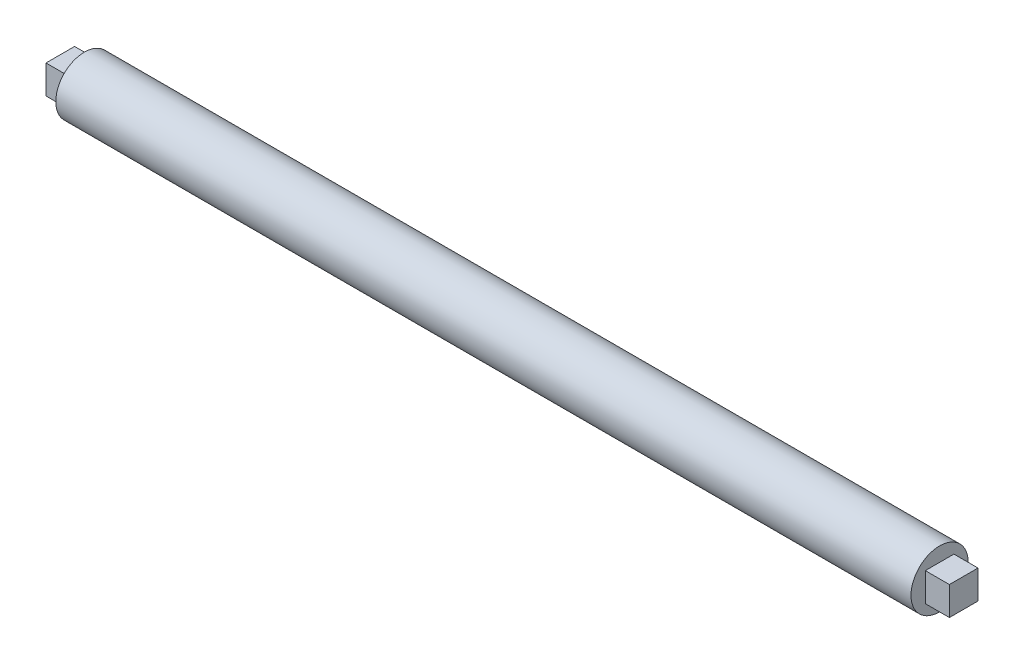
ISO-10303-21;
HEADER;
FILE_DESCRIPTION(('STEP AP214'),'2;1');
FILE_NAME('part.step','',(''),(''),'','','');
FILE_SCHEMA(('AUTOMOTIVE_DESIGN { 1 0 10303 214 1 1 1 1 }'));
ENDSEC;
DATA;
#1=APPLICATION_CONTEXT('core data for automotive mechanical design processes');
#2=APPLICATION_PROTOCOL_DEFINITION('international standard','automotive_design',2000,#1);
#3=PRODUCT_CONTEXT('',#1,'mechanical');
#4=PRODUCT('Part','Part','',(#3));
#5=PRODUCT_RELATED_PRODUCT_CATEGORY('part','',(#4));
#6=PRODUCT_DEFINITION_FORMATION('','',#4);
#7=PRODUCT_DEFINITION_CONTEXT('part definition',#1,'design');
#8=PRODUCT_DEFINITION('design','',#6,#7);
#9=PRODUCT_DEFINITION_SHAPE('','',#8);
#10=(LENGTH_UNIT() NAMED_UNIT(*) SI_UNIT(.MILLI.,.METRE.));
#11=(NAMED_UNIT(*) PLANE_ANGLE_UNIT() SI_UNIT($,.RADIAN.));
#12=(NAMED_UNIT(*) SI_UNIT($,.STERADIAN.) SOLID_ANGLE_UNIT());
#13=UNCERTAINTY_MEASURE_WITH_UNIT(LENGTH_MEASURE(1.E-05),#10,'distance_accuracy_value','');
#14=(GEOMETRIC_REPRESENTATION_CONTEXT(3) GLOBAL_UNCERTAINTY_ASSIGNED_CONTEXT((#13)) GLOBAL_UNIT_ASSIGNED_CONTEXT((#10,
#11,#12)) REPRESENTATION_CONTEXT('',''));
#15=CARTESIAN_POINT('',(0.,0.,0.));
#16=DIRECTION('',(0.,0.,1.));
#17=DIRECTION('',(1.,0.,0.));
#18=AXIS2_PLACEMENT_3D('',#15,#16,#17);
#19=CARTESIAN_POINT('',(0.,0.,0.));
#20=DIRECTION('',(-1.,0.,0.));
#21=DIRECTION('',(0.,0.,1.));
#22=AXIS2_PLACEMENT_3D('',#19,#20,#21);
#23=PLANE('',#22);
#24=DIRECTION('',(0.,0.,-1.));
#25=VECTOR('',#24,1.);
#26=CARTESIAN_POINT('',(0.,2.375,-4.75));
#27=LINE('',#26,#25);
#28=CARTESIAN_POINT('',(0.,2.375,-2.375));
#29=VERTEX_POINT('',#28);
#30=CARTESIAN_POINT('',(0.,2.375,-7.125));
#31=VERTEX_POINT('',#30);
#32=EDGE_CURVE('E56',#29,#31,#27,.T.);
#33=ORIENTED_EDGE('',*,*,#32,.F.);
#34=DIRECTION('',(0.,1.,0.));
#35=VECTOR('',#34,1.);
#36=CARTESIAN_POINT('',(0.,-2.375,-2.375));
#37=LINE('',#36,#35);
#38=CARTESIAN_POINT('',(0.,-2.375,-2.375));
#39=VERTEX_POINT('',#38);
#40=EDGE_CURVE('E60',#39,#29,#37,.T.);
#41=ORIENTED_EDGE('',*,*,#40,.F.);
#42=DIRECTION('',(0.,0.,1.));
#43=VECTOR('',#42,1.);
#44=CARTESIAN_POINT('',(0.,-2.375,-7.125));
#45=LINE('',#44,#43);
#46=CARTESIAN_POINT('',(0.,-2.375,-7.125));
#47=VERTEX_POINT('',#46);
#48=EDGE_CURVE('E142',#47,#39,#45,.T.);
#49=ORIENTED_EDGE('',*,*,#48,.F.);
#50=DIRECTION('',(0.,-1.,0.));
#51=VECTOR('',#50,1.);
#52=CARTESIAN_POINT('',(0.,2.375,-7.125));
#53=LINE('',#52,#51);
#54=EDGE_CURVE('E139',#31,#47,#53,.T.);
#55=ORIENTED_EDGE('',*,*,#54,.F.);
#56=EDGE_LOOP('',(#33,#41,#49,#55));
#57=FACE_BOUND('',#56,.T.);
#58=CARTESIAN_POINT('',(0.,0.,-4.75));
#59=DIRECTION('',(-1.,0.,0.));
#60=DIRECTION('',(0.,0.,1.));
#61=AXIS2_PLACEMENT_3D('',#58,#59,#60);
#62=CIRCLE('',#61,4.75);
#63=CARTESIAN_POINT('',(0.,0.,0.));
#64=VERTEX_POINT('',#63);
#65=EDGE_CURVE('E11',#64,#64,#62,.T.);
#66=ORIENTED_EDGE('',*,*,#65,.T.);
#67=EDGE_LOOP('',(#66));
#68=FACE_BOUND('',#67,.T.);
#69=ADVANCED_FACE('F41',(#57,#68),#23,.T.);
#70=CARTESIAN_POINT('',(142.,0.,-4.75));
#71=DIRECTION('',(1.,0.,0.));
#72=DIRECTION('',(0.,0.,-1.));
#73=AXIS2_PLACEMENT_3D('',#70,#71,#72);
#74=PLANE('',#73);
#75=DIRECTION('',(0.,0.,1.));
#76=VECTOR('',#75,1.);
#77=CARTESIAN_POINT('',(142.,2.375,-2.375));
#78=LINE('',#77,#76);
#79=CARTESIAN_POINT('',(142.,2.375,-7.125));
#80=VERTEX_POINT('',#79);
#81=CARTESIAN_POINT('',(142.,2.375,-2.375));
#82=VERTEX_POINT('',#81);
#83=EDGE_CURVE('E122',#80,#82,#78,.T.);
#84=ORIENTED_EDGE('',*,*,#83,.F.);
#85=DIRECTION('',(0.,1.,0.));
#86=VECTOR('',#85,1.);
#87=CARTESIAN_POINT('',(142.,2.375,-7.125));
#88=LINE('',#87,#86);
#89=CARTESIAN_POINT('',(142.,-2.375,-7.125));
#90=VERTEX_POINT('',#89);
#91=EDGE_CURVE('E160',#90,#80,#88,.T.);
#92=ORIENTED_EDGE('',*,*,#91,.F.);
#93=DIRECTION('',(0.,0.,-1.));
#94=VECTOR('',#93,1.);
#95=CARTESIAN_POINT('',(142.,-2.375,-7.125));
#96=LINE('',#95,#94);
#97=CARTESIAN_POINT('',(142.,-2.375,-2.375));
#98=VERTEX_POINT('',#97);
#99=EDGE_CURVE('E177',#98,#90,#96,.T.);
#100=ORIENTED_EDGE('',*,*,#99,.F.);
#101=DIRECTION('',(0.,-1.,0.));
#102=VECTOR('',#101,1.);
#103=CARTESIAN_POINT('',(142.,2.375,-2.375));
#104=LINE('',#103,#102);
#105=EDGE_CURVE('E173',#82,#98,#104,.T.);
#106=ORIENTED_EDGE('',*,*,#105,.F.);
#107=EDGE_LOOP('',(#84,#92,#100,#106));
#108=FACE_BOUND('',#107,.T.);
#109=CARTESIAN_POINT('',(142.,0.,-4.75));
#110=DIRECTION('',(-1.,0.,0.));
#111=DIRECTION('',(0.,0.,1.));
#112=AXIS2_PLACEMENT_3D('',#109,#110,#111);
#113=CIRCLE('',#112,4.75);
#114=CARTESIAN_POINT('',(142.,0.,0.));
#115=VERTEX_POINT('',#114);
#116=EDGE_CURVE('E49',#115,#115,#113,.T.);
#117=ORIENTED_EDGE('',*,*,#116,.F.);
#118=EDGE_LOOP('',(#117));
#119=FACE_BOUND('',#118,.T.);
#120=ADVANCED_FACE('F205',(#108,#119),#74,.T.);
#121=CARTESIAN_POINT('',(0.,0.,-4.75));
#122=DIRECTION('',(-1.,0.,0.));
#123=DIRECTION('',(0.,0.,1.));
#124=AXIS2_PLACEMENT_3D('',#121,#122,#123);
#125=CYLINDRICAL_SURFACE('',#124,4.75);
#126=ORIENTED_EDGE('',*,*,#116,.T.);
#127=EDGE_LOOP('',(#126));
#128=FACE_BOUND('',#127,.T.);
#129=ORIENTED_EDGE('',*,*,#65,.F.);
#130=EDGE_LOOP('',(#129));
#131=FACE_BOUND('',#130,.T.);
#132=ADVANCED_FACE('F202',(#128,#131),#125,.T.);
#133=CARTESIAN_POINT('',(146.,2.375,-2.375));
#134=DIRECTION('',(0.,-1.,0.));
#135=DIRECTION('',(0.,0.,-1.));
#136=AXIS2_PLACEMENT_3D('',#133,#134,#135);
#137=PLANE('',#136);
#138=ORIENTED_EDGE('',*,*,#83,.T.);
#139=DIRECTION('',(-1.,0.,0.));
#140=VECTOR('',#139,1.);
#141=CARTESIAN_POINT('',(146.,2.375,-2.375));
#142=LINE('',#141,#140);
#143=CARTESIAN_POINT('',(146.,2.375,-2.375));
#144=VERTEX_POINT('',#143);
#145=EDGE_CURVE('E195',#144,#82,#142,.T.);
#146=ORIENTED_EDGE('',*,*,#145,.F.);
#147=DIRECTION('',(0.,0.,1.));
#148=VECTOR('',#147,1.);
#149=CARTESIAN_POINT('',(146.,2.375,-2.375));
#150=LINE('',#149,#148);
#151=CARTESIAN_POINT('',(146.,2.375,-7.125));
#152=VERTEX_POINT('',#151);
#153=EDGE_CURVE('E155',#152,#144,#150,.T.);
#154=ORIENTED_EDGE('',*,*,#153,.F.);
#155=DIRECTION('',(-1.,0.,0.));
#156=VECTOR('',#155,1.);
#157=CARTESIAN_POINT('',(146.,2.375,-7.125));
#158=LINE('',#157,#156);
#159=EDGE_CURVE('E169',#152,#80,#158,.T.);
#160=ORIENTED_EDGE('',*,*,#159,.T.);
#161=EDGE_LOOP('',(#138,#146,#154,#160));
#162=FACE_BOUND('',#161,.T.);
#163=ADVANCED_FACE('F212',(#162),#137,.F.);
#164=CARTESIAN_POINT('',(146.,2.375,-2.375));
#165=DIRECTION('',(0.,0.,-1.));
#166=DIRECTION('',(0.,1.,0.));
#167=AXIS2_PLACEMENT_3D('',#164,#165,#166);
#168=PLANE('',#167);
#169=ORIENTED_EDGE('',*,*,#105,.T.);
#170=DIRECTION('',(-1.,0.,0.));
#171=VECTOR('',#170,1.);
#172=CARTESIAN_POINT('',(146.,-2.375,-2.375));
#173=LINE('',#172,#171);
#174=CARTESIAN_POINT('',(146.,-2.375,-2.375));
#175=VERTEX_POINT('',#174);
#176=EDGE_CURVE('E191',#175,#98,#173,.T.);
#177=ORIENTED_EDGE('',*,*,#176,.F.);
#178=DIRECTION('',(0.,-1.,0.));
#179=VECTOR('',#178,1.);
#180=CARTESIAN_POINT('',(146.,2.375,-2.375));
#181=LINE('',#180,#179);
#182=EDGE_CURVE('E159',#144,#175,#181,.T.);
#183=ORIENTED_EDGE('',*,*,#182,.F.);
#184=ORIENTED_EDGE('',*,*,#145,.T.);
#185=EDGE_LOOP('',(#169,#177,#183,#184));
#186=FACE_BOUND('',#185,.T.);
#187=ADVANCED_FACE('F217',(#186),#168,.F.);
#188=CARTESIAN_POINT('',(146.,-2.375,-7.125));
#189=DIRECTION('',(0.,1.,0.));
#190=DIRECTION('',(0.,0.,1.));
#191=AXIS2_PLACEMENT_3D('',#188,#189,#190);
#192=PLANE('',#191);
#193=ORIENTED_EDGE('',*,*,#99,.T.);
#194=DIRECTION('',(-1.,0.,0.));
#195=VECTOR('',#194,1.);
#196=CARTESIAN_POINT('',(146.,-2.375,-7.125));
#197=LINE('',#196,#195);
#198=CARTESIAN_POINT('',(146.,-2.375,-7.125));
#199=VERTEX_POINT('',#198);
#200=EDGE_CURVE('E187',#199,#90,#197,.T.);
#201=ORIENTED_EDGE('',*,*,#200,.F.);
#202=DIRECTION('',(0.,0.,-1.));
#203=VECTOR('',#202,1.);
#204=CARTESIAN_POINT('',(146.,-2.375,-7.125));
#205=LINE('',#204,#203);
#206=EDGE_CURVE('E163',#175,#199,#205,.T.);
#207=ORIENTED_EDGE('',*,*,#206,.F.);
#208=ORIENTED_EDGE('',*,*,#176,.T.);
#209=EDGE_LOOP('',(#193,#201,#207,#208));
#210=FACE_BOUND('',#209,.T.);
#211=ADVANCED_FACE('F221',(#210),#192,.F.);
#212=CARTESIAN_POINT('',(146.,2.375,-7.125));
#213=DIRECTION('',(0.,0.,1.));
#214=DIRECTION('',(1.,0.,0.));
#215=AXIS2_PLACEMENT_3D('',#212,#213,#214);
#216=PLANE('',#215);
#217=ORIENTED_EDGE('',*,*,#91,.T.);
#218=ORIENTED_EDGE('',*,*,#159,.F.);
#219=DIRECTION('',(0.,1.,0.));
#220=VECTOR('',#219,1.);
#221=CARTESIAN_POINT('',(146.,2.375,-7.125));
#222=LINE('',#221,#220);
#223=EDGE_CURVE('E166',#199,#152,#222,.T.);
#224=ORIENTED_EDGE('',*,*,#223,.F.);
#225=ORIENTED_EDGE('',*,*,#200,.T.);
#226=EDGE_LOOP('',(#217,#218,#224,#225));
#227=FACE_BOUND('',#226,.T.);
#228=ADVANCED_FACE('F225',(#227),#216,.F.);
#229=CARTESIAN_POINT('',(146.,0.,0.));
#230=DIRECTION('',(-1.,0.,0.));
#231=DIRECTION('',(0.,0.,1.));
#232=AXIS2_PLACEMENT_3D('',#229,#230,#231);
#233=PLANE('',#232);
#234=ORIENTED_EDGE('',*,*,#153,.T.);
#235=ORIENTED_EDGE('',*,*,#182,.T.);
#236=ORIENTED_EDGE('',*,*,#206,.T.);
#237=ORIENTED_EDGE('',*,*,#223,.T.);
#238=EDGE_LOOP('',(#234,#235,#236,#237));
#239=FACE_BOUND('',#238,.T.);
#240=ADVANCED_FACE('F229',(#239),#233,.F.);
#241=CARTESIAN_POINT('',(-4.,2.375,-4.75));
#242=DIRECTION('',(0.,-1.,0.));
#243=DIRECTION('',(0.,0.,-1.));
#244=AXIS2_PLACEMENT_3D('',#241,#242,#243);
#245=PLANE('',#244);
#246=ORIENTED_EDGE('',*,*,#32,.T.);
#247=DIRECTION('',(1.,0.,0.));
#248=VECTOR('',#247,1.);
#249=CARTESIAN_POINT('',(-4.,2.375,-7.125));
#250=LINE('',#249,#248);
#251=CARTESIAN_POINT('',(-4.,2.375,-7.125));
#252=VERTEX_POINT('',#251);
#253=EDGE_CURVE('E117',#252,#31,#250,.T.);
#254=ORIENTED_EDGE('',*,*,#253,.F.);
#255=DIRECTION('',(0.,0.,-1.));
#256=VECTOR('',#255,1.);
#257=CARTESIAN_POINT('',(-4.,2.375,-2.375));
#258=LINE('',#257,#256);
#259=CARTESIAN_POINT('',(-4.,2.375,-2.375));
#260=VERTEX_POINT('',#259);
#261=EDGE_CURVE('E103',#260,#252,#258,.T.);
#262=ORIENTED_EDGE('',*,*,#261,.F.);
#263=DIRECTION('',(1.,0.,0.));
#264=VECTOR('',#263,1.);
#265=CARTESIAN_POINT('',(-4.,2.375,-2.375));
#266=LINE('',#265,#264);
#267=EDGE_CURVE('E136',#260,#29,#266,.T.);
#268=ORIENTED_EDGE('',*,*,#267,.T.);
#269=EDGE_LOOP('',(#246,#254,#262,#268));
#270=FACE_BOUND('',#269,.T.);
#271=ADVANCED_FACE('F118',(#270),#245,.F.);
#272=CARTESIAN_POINT('',(-4.,2.375,-7.125));
#273=DIRECTION('',(0.,0.,1.));
#274=DIRECTION('',(1.,0.,0.));
#275=AXIS2_PLACEMENT_3D('',#272,#273,#274);
#276=PLANE('',#275);
#277=ORIENTED_EDGE('',*,*,#54,.T.);
#278=DIRECTION('',(1.,0.,0.));
#279=VECTOR('',#278,1.);
#280=CARTESIAN_POINT('',(-4.,-2.375,-7.125));
#281=LINE('',#280,#279);
#282=CARTESIAN_POINT('',(-4.,-2.375,-7.125));
#283=VERTEX_POINT('',#282);
#284=EDGE_CURVE('E123',#283,#47,#281,.T.);
#285=ORIENTED_EDGE('',*,*,#284,.F.);
#286=DIRECTION('',(0.,-1.,0.));
#287=VECTOR('',#286,1.);
#288=CARTESIAN_POINT('',(-4.,2.375,-7.125));
#289=LINE('',#288,#287);
#290=EDGE_CURVE('E107',#252,#283,#289,.T.);
#291=ORIENTED_EDGE('',*,*,#290,.F.);
#292=ORIENTED_EDGE('',*,*,#253,.T.);
#293=EDGE_LOOP('',(#277,#285,#291,#292));
#294=FACE_BOUND('',#293,.T.);
#295=ADVANCED_FACE('F125',(#294),#276,.F.);
#296=CARTESIAN_POINT('',(-4.,-2.375,-7.125));
#297=DIRECTION('',(0.,1.,0.));
#298=DIRECTION('',(0.,0.,1.));
#299=AXIS2_PLACEMENT_3D('',#296,#297,#298);
#300=PLANE('',#299);
#301=ORIENTED_EDGE('',*,*,#48,.T.);
#302=DIRECTION('',(1.,0.,0.));
#303=VECTOR('',#302,1.);
#304=CARTESIAN_POINT('',(-4.,-2.375,-2.375));
#305=LINE('',#304,#303);
#306=CARTESIAN_POINT('',(-4.,-2.375,-2.375));
#307=VERTEX_POINT('',#306);
#308=EDGE_CURVE('E149',#307,#39,#305,.T.);
#309=ORIENTED_EDGE('',*,*,#308,.F.);
#310=DIRECTION('',(0.,0.,1.));
#311=VECTOR('',#310,1.);
#312=CARTESIAN_POINT('',(-4.,-2.375,-7.125));
#313=LINE('',#312,#311);
#314=EDGE_CURVE('E129',#283,#307,#313,.T.);
#315=ORIENTED_EDGE('',*,*,#314,.F.);
#316=ORIENTED_EDGE('',*,*,#284,.T.);
#317=EDGE_LOOP('',(#301,#309,#315,#316));
#318=FACE_BOUND('',#317,.T.);
#319=ADVANCED_FACE('F238',(#318),#300,.F.);
#320=CARTESIAN_POINT('',(-4.,-2.375,-2.375));
#321=DIRECTION('',(0.,0.,-1.));
#322=DIRECTION('',(-1.,0.,0.));
#323=AXIS2_PLACEMENT_3D('',#320,#321,#322);
#324=PLANE('',#323);
#325=ORIENTED_EDGE('',*,*,#40,.T.);
#326=ORIENTED_EDGE('',*,*,#267,.F.);
#327=DIRECTION('',(0.,1.,0.));
#328=VECTOR('',#327,1.);
#329=CARTESIAN_POINT('',(-4.,-2.375,-2.375));
#330=LINE('',#329,#328);
#331=EDGE_CURVE('E110',#307,#260,#330,.T.);
#332=ORIENTED_EDGE('',*,*,#331,.F.);
#333=ORIENTED_EDGE('',*,*,#308,.T.);
#334=EDGE_LOOP('',(#325,#326,#332,#333));
#335=FACE_BOUND('',#334,.T.);
#336=ADVANCED_FACE('F241',(#335),#324,.F.);
#337=CARTESIAN_POINT('',(-4.,0.,0.));
#338=DIRECTION('',(-1.,0.,0.));
#339=DIRECTION('',(0.,0.,1.));
#340=AXIS2_PLACEMENT_3D('',#337,#338,#339);
#341=PLANE('',#340);
#342=ORIENTED_EDGE('',*,*,#261,.T.);
#343=ORIENTED_EDGE('',*,*,#290,.T.);
#344=ORIENTED_EDGE('',*,*,#314,.T.);
#345=ORIENTED_EDGE('',*,*,#331,.T.);
#346=EDGE_LOOP('',(#342,#343,#344,#345));
#347=FACE_BOUND('',#346,.T.);
#348=ADVANCED_FACE('F105',(#347),#341,.T.);
#349=CLOSED_SHELL('',(#69,#120,#132,#163,#187,#211,#228,#240,#271,#295,#319,#336,#348));
#350=MANIFOLD_SOLID_BREP('B2',#349);
#351=ADVANCED_BREP_SHAPE_REPRESENTATION('',(#18,#350),#14);
#352=SHAPE_DEFINITION_REPRESENTATION(#9,#351);
ENDSEC;
END-ISO-10303-21;
